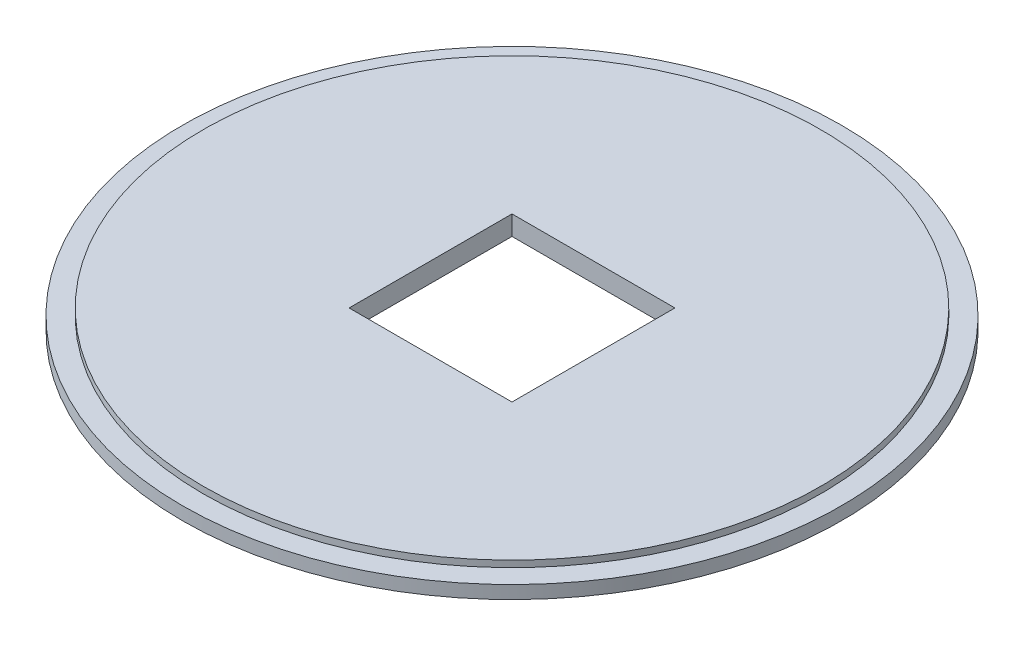
ISO-10303-21;
HEADER;
FILE_DESCRIPTION(('STEP AP214'),'2;1');
FILE_NAME('part.step','',(''),(''),'','','');
FILE_SCHEMA(('AUTOMOTIVE_DESIGN { 1 0 10303 214 1 1 1 1 }'));
ENDSEC;
DATA;
#1=APPLICATION_CONTEXT('core data for automotive mechanical design processes');
#2=APPLICATION_PROTOCOL_DEFINITION('international standard','automotive_design',2000,#1);
#3=PRODUCT_CONTEXT('',#1,'mechanical');
#4=PRODUCT('Part','Part','',(#3));
#5=PRODUCT_RELATED_PRODUCT_CATEGORY('part','',(#4));
#6=PRODUCT_DEFINITION_FORMATION('','',#4);
#7=PRODUCT_DEFINITION_CONTEXT('part definition',#1,'design');
#8=PRODUCT_DEFINITION('design','',#6,#7);
#9=PRODUCT_DEFINITION_SHAPE('','',#8);
#10=(LENGTH_UNIT() NAMED_UNIT(*) SI_UNIT(.MILLI.,.METRE.));
#11=(NAMED_UNIT(*) PLANE_ANGLE_UNIT() SI_UNIT($,.RADIAN.));
#12=(NAMED_UNIT(*) SI_UNIT($,.STERADIAN.) SOLID_ANGLE_UNIT());
#13=UNCERTAINTY_MEASURE_WITH_UNIT(LENGTH_MEASURE(1.E-05),#10,'distance_accuracy_value','');
#14=(GEOMETRIC_REPRESENTATION_CONTEXT(3) GLOBAL_UNCERTAINTY_ASSIGNED_CONTEXT((#13)) GLOBAL_UNIT_ASSIGNED_CONTEXT((#10,
#11,#12)) REPRESENTATION_CONTEXT('',''));
#15=CARTESIAN_POINT('',(0.,0.,0.));
#16=DIRECTION('',(0.,0.,1.));
#17=DIRECTION('',(1.,0.,0.));
#18=AXIS2_PLACEMENT_3D('',#15,#16,#17);
#19=CARTESIAN_POINT('',(0.,0.,0.));
#20=DIRECTION('',(0.,-1.,0.));
#21=DIRECTION('',(0.,0.,-1.));
#22=AXIS2_PLACEMENT_3D('',#19,#20,#21);
#23=PLANE('',#22);
#24=CARTESIAN_POINT('',(0.,0.,0.));
#25=DIRECTION('',(0.,1.,0.));
#26=DIRECTION('',(0.,0.,1.));
#27=AXIS2_PLACEMENT_3D('',#24,#25,#26);
#28=CIRCLE('',#27,101.15);
#29=CARTESIAN_POINT('',(0.,0.,101.15));
#30=VERTEX_POINT('',#29);
#31=EDGE_CURVE('E107',#30,#30,#28,.T.);
#32=ORIENTED_EDGE('',*,*,#31,.F.);
#33=EDGE_LOOP('',(#32));
#34=FACE_BOUND('',#33,.T.);
#35=DIRECTION('',(1.,0.,0.));
#36=VECTOR('',#35,1.);
#37=CARTESIAN_POINT('',(-25.,0.,25.));
#38=LINE('',#37,#36);
#39=CARTESIAN_POINT('',(-25.,0.,25.));
#40=VERTEX_POINT('',#39);
#41=CARTESIAN_POINT('',(25.,0.,25.));
#42=VERTEX_POINT('',#41);
#43=EDGE_CURVE('E90',#40,#42,#38,.T.);
#44=ORIENTED_EDGE('',*,*,#43,.T.);
#45=DIRECTION('',(0.,0.,-1.));
#46=VECTOR('',#45,1.);
#47=CARTESIAN_POINT('',(25.,0.,25.));
#48=LINE('',#47,#46);
#49=CARTESIAN_POINT('',(25.,0.,-25.));
#50=VERTEX_POINT('',#49);
#51=EDGE_CURVE('E47',#42,#50,#48,.T.);
#52=ORIENTED_EDGE('',*,*,#51,.T.);
#53=DIRECTION('',(-1.,0.,0.));
#54=VECTOR('',#53,1.);
#55=CARTESIAN_POINT('',(-25.,0.,-25.));
#56=LINE('',#55,#54);
#57=CARTESIAN_POINT('',(-25.,0.,-25.));
#58=VERTEX_POINT('',#57);
#59=EDGE_CURVE('E81',#50,#58,#56,.T.);
#60=ORIENTED_EDGE('',*,*,#59,.T.);
#61=DIRECTION('',(0.,0.,1.));
#62=VECTOR('',#61,1.);
#63=CARTESIAN_POINT('',(-25.,0.,25.));
#64=LINE('',#63,#62);
#65=EDGE_CURVE('E87',#58,#40,#64,.T.);
#66=ORIENTED_EDGE('',*,*,#65,.T.);
#67=EDGE_LOOP('',(#44,#52,#60,#66));
#68=FACE_BOUND('',#67,.T.);
#69=ADVANCED_FACE('F33',(#34,#68),#23,.T.);
#70=CARTESIAN_POINT('',(-94.8,6.,0.));
#71=DIRECTION('',(0.,1.,0.));
#72=DIRECTION('',(0.,0.,1.));
#73=AXIS2_PLACEMENT_3D('',#70,#71,#72);
#74=PLANE('',#73);
#75=CARTESIAN_POINT('',(0.,6.,0.));
#76=DIRECTION('',(0.,1.,0.));
#77=DIRECTION('',(0.,0.,1.));
#78=AXIS2_PLACEMENT_3D('',#75,#76,#77);
#79=CIRCLE('',#78,94.8);
#80=CARTESIAN_POINT('',(0.,6.,94.8));
#81=VERTEX_POINT('',#80);
#82=EDGE_CURVE('E77',#81,#81,#79,.T.);
#83=ORIENTED_EDGE('',*,*,#82,.T.);
#84=EDGE_LOOP('',(#83));
#85=FACE_BOUND('',#84,.T.);
#86=DIRECTION('',(1.,0.,0.));
#87=VECTOR('',#86,1.);
#88=CARTESIAN_POINT('',(-94.8,6.,-25.));
#89=LINE('',#88,#87);
#90=CARTESIAN_POINT('',(-25.,6.,-25.));
#91=VERTEX_POINT('',#90);
#92=CARTESIAN_POINT('',(25.,6.,-25.));
#93=VERTEX_POINT('',#92);
#94=EDGE_CURVE('E40',#91,#93,#89,.T.);
#95=ORIENTED_EDGE('',*,*,#94,.T.);
#96=DIRECTION('',(0.,0.,1.));
#97=VECTOR('',#96,1.);
#98=CARTESIAN_POINT('',(25.,6.,0.));
#99=LINE('',#98,#97);
#100=CARTESIAN_POINT('',(25.,6.,25.));
#101=VERTEX_POINT('',#100);
#102=EDGE_CURVE('E11',#93,#101,#99,.T.);
#103=ORIENTED_EDGE('',*,*,#102,.T.);
#104=DIRECTION('',(-1.,0.,0.));
#105=VECTOR('',#104,1.);
#106=CARTESIAN_POINT('',(-94.8,6.,25.));
#107=LINE('',#106,#105);
#108=CARTESIAN_POINT('',(-25.,6.,25.));
#109=VERTEX_POINT('',#108);
#110=EDGE_CURVE('E110',#101,#109,#107,.T.);
#111=ORIENTED_EDGE('',*,*,#110,.T.);
#112=DIRECTION('',(0.,0.,-1.));
#113=VECTOR('',#112,1.);
#114=CARTESIAN_POINT('',(-25.,6.,0.));
#115=LINE('',#114,#113);
#116=EDGE_CURVE('E113',#109,#91,#115,.T.);
#117=ORIENTED_EDGE('',*,*,#116,.T.);
#118=EDGE_LOOP('',(#95,#103,#111,#117));
#119=FACE_BOUND('',#118,.T.);
#120=ADVANCED_FACE('F116',(#85,#119),#74,.T.);
#121=CARTESIAN_POINT('',(0.,6.,0.));
#122=DIRECTION('',(0.,1.,0.));
#123=DIRECTION('',(0.,0.,1.));
#124=AXIS2_PLACEMENT_3D('',#121,#122,#123);
#125=CYLINDRICAL_SURFACE('',#124,101.15);
#126=ORIENTED_EDGE('',*,*,#31,.T.);
#127=EDGE_LOOP('',(#126));
#128=FACE_BOUND('',#127,.T.);
#129=CARTESIAN_POINT('',(0.,4.,0.));
#130=DIRECTION('',(0.,1.,0.));
#131=DIRECTION('',(0.,0.,1.));
#132=AXIS2_PLACEMENT_3D('',#129,#130,#131);
#133=CIRCLE('',#132,101.15);
#134=CARTESIAN_POINT('',(0.,4.,101.15));
#135=VERTEX_POINT('',#134);
#136=EDGE_CURVE('E104',#135,#135,#133,.T.);
#137=ORIENTED_EDGE('',*,*,#136,.F.);
#138=EDGE_LOOP('',(#137));
#139=FACE_BOUND('',#138,.T.);
#140=ADVANCED_FACE('F132',(#128,#139),#125,.T.);
#141=CARTESIAN_POINT('',(-101.15,4.,0.));
#142=DIRECTION('',(0.,1.,0.));
#143=DIRECTION('',(0.,0.,1.));
#144=AXIS2_PLACEMENT_3D('',#141,#142,#143);
#145=PLANE('',#144);
#146=ORIENTED_EDGE('',*,*,#136,.T.);
#147=EDGE_LOOP('',(#146));
#148=FACE_BOUND('',#147,.T.);
#149=CARTESIAN_POINT('',(0.,4.,0.));
#150=DIRECTION('',(0.,1.,0.));
#151=DIRECTION('',(0.,0.,1.));
#152=AXIS2_PLACEMENT_3D('',#149,#150,#151);
#153=CIRCLE('',#152,94.8);
#154=CARTESIAN_POINT('',(0.,4.,94.8));
#155=VERTEX_POINT('',#154);
#156=EDGE_CURVE('E101',#155,#155,#153,.T.);
#157=ORIENTED_EDGE('',*,*,#156,.F.);
#158=EDGE_LOOP('',(#157));
#159=FACE_BOUND('',#158,.T.);
#160=ADVANCED_FACE('F139',(#148,#159),#145,.T.);
#161=CARTESIAN_POINT('',(0.,6.,0.));
#162=DIRECTION('',(0.,1.,0.));
#163=DIRECTION('',(0.,0.,1.));
#164=AXIS2_PLACEMENT_3D('',#161,#162,#163);
#165=CYLINDRICAL_SURFACE('',#164,94.8);
#166=ORIENTED_EDGE('',*,*,#156,.T.);
#167=EDGE_LOOP('',(#166));
#168=FACE_BOUND('',#167,.T.);
#169=ORIENTED_EDGE('',*,*,#82,.F.);
#170=EDGE_LOOP('',(#169));
#171=FACE_BOUND('',#170,.T.);
#172=ADVANCED_FACE('F144',(#168,#171),#165,.T.);
#173=CARTESIAN_POINT('',(25.,10.,25.));
#174=DIRECTION('',(-1.,0.,0.));
#175=DIRECTION('',(0.,0.,1.));
#176=AXIS2_PLACEMENT_3D('',#173,#174,#175);
#177=PLANE('',#176);
#178=DIRECTION('',(0.,-1.,0.));
#179=VECTOR('',#178,1.);
#180=CARTESIAN_POINT('',(25.,10.,-25.));
#181=LINE('',#180,#179);
#182=EDGE_CURVE('E72',#93,#50,#181,.T.);
#183=ORIENTED_EDGE('',*,*,#182,.T.);
#184=ORIENTED_EDGE('',*,*,#51,.F.);
#185=DIRECTION('',(0.,-1.,0.));
#186=VECTOR('',#185,1.);
#187=CARTESIAN_POINT('',(25.,10.,25.));
#188=LINE('',#187,#186);
#189=EDGE_CURVE('E95',#101,#42,#188,.T.);
#190=ORIENTED_EDGE('',*,*,#189,.F.);
#191=ORIENTED_EDGE('',*,*,#102,.F.);
#192=EDGE_LOOP('',(#183,#184,#190,#191));
#193=FACE_BOUND('',#192,.T.);
#194=ADVANCED_FACE('F74',(#193),#177,.T.);
#195=CARTESIAN_POINT('',(-25.,10.,-25.));
#196=DIRECTION('',(0.,0.,1.));
#197=DIRECTION('',(1.,0.,0.));
#198=AXIS2_PLACEMENT_3D('',#195,#196,#197);
#199=PLANE('',#198);
#200=DIRECTION('',(0.,-1.,0.));
#201=VECTOR('',#200,1.);
#202=CARTESIAN_POINT('',(-25.,10.,-25.));
#203=LINE('',#202,#201);
#204=EDGE_CURVE('E78',#91,#58,#203,.T.);
#205=ORIENTED_EDGE('',*,*,#204,.T.);
#206=ORIENTED_EDGE('',*,*,#59,.F.);
#207=ORIENTED_EDGE('',*,*,#182,.F.);
#208=ORIENTED_EDGE('',*,*,#94,.F.);
#209=EDGE_LOOP('',(#205,#206,#207,#208));
#210=FACE_BOUND('',#209,.T.);
#211=ADVANCED_FACE('F82',(#210),#199,.T.);
#212=CARTESIAN_POINT('',(-25.,10.,25.));
#213=DIRECTION('',(1.,0.,0.));
#214=DIRECTION('',(0.,0.,-1.));
#215=AXIS2_PLACEMENT_3D('',#212,#213,#214);
#216=PLANE('',#215);
#217=DIRECTION('',(0.,-1.,0.));
#218=VECTOR('',#217,1.);
#219=CARTESIAN_POINT('',(-25.,10.,25.));
#220=LINE('',#219,#218);
#221=EDGE_CURVE('E55',#109,#40,#220,.T.);
#222=ORIENTED_EDGE('',*,*,#221,.T.);
#223=ORIENTED_EDGE('',*,*,#65,.F.);
#224=ORIENTED_EDGE('',*,*,#204,.F.);
#225=ORIENTED_EDGE('',*,*,#116,.F.);
#226=EDGE_LOOP('',(#222,#223,#224,#225));
#227=FACE_BOUND('',#226,.T.);
#228=ADVANCED_FACE('F118',(#227),#216,.T.);
#229=CARTESIAN_POINT('',(-25.,10.,25.));
#230=DIRECTION('',(0.,0.,-1.));
#231=DIRECTION('',(-1.,0.,0.));
#232=AXIS2_PLACEMENT_3D('',#229,#230,#231);
#233=PLANE('',#232);
#234=ORIENTED_EDGE('',*,*,#189,.T.);
#235=ORIENTED_EDGE('',*,*,#43,.F.);
#236=ORIENTED_EDGE('',*,*,#221,.F.);
#237=ORIENTED_EDGE('',*,*,#110,.F.);
#238=EDGE_LOOP('',(#234,#235,#236,#237));
#239=FACE_BOUND('',#238,.T.);
#240=ADVANCED_FACE('F119',(#239),#233,.T.);
#241=CLOSED_SHELL('',(#69,#120,#140,#160,#172,#194,#211,#228,#240));
#242=MANIFOLD_SOLID_BREP('B2',#241);
#243=ADVANCED_BREP_SHAPE_REPRESENTATION('',(#18,#242),#14);
#244=SHAPE_DEFINITION_REPRESENTATION(#9,#243);
ENDSEC;
END-ISO-10303-21;
